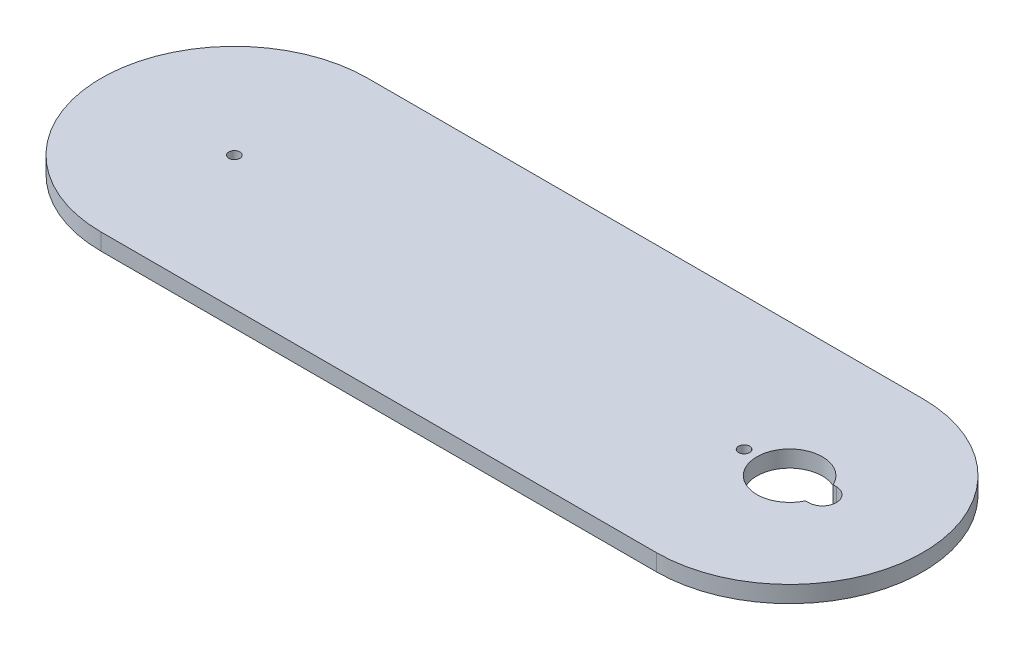
ISO-10303-21;
HEADER;
FILE_DESCRIPTION(('STEP AP214'),'2;1');
FILE_NAME('part.step','',(''),(''),'','','');
FILE_SCHEMA(('AUTOMOTIVE_DESIGN { 1 0 10303 214 1 1 1 1 }'));
ENDSEC;
DATA;
#1=APPLICATION_CONTEXT('core data for automotive mechanical design processes');
#2=APPLICATION_PROTOCOL_DEFINITION('international standard','automotive_design',2000,#1);
#3=PRODUCT_CONTEXT('',#1,'mechanical');
#4=PRODUCT('Part','Part','',(#3));
#5=PRODUCT_RELATED_PRODUCT_CATEGORY('part','',(#4));
#6=PRODUCT_DEFINITION_FORMATION('','',#4);
#7=PRODUCT_DEFINITION_CONTEXT('part definition',#1,'design');
#8=PRODUCT_DEFINITION('design','',#6,#7);
#9=PRODUCT_DEFINITION_SHAPE('','',#8);
#10=(LENGTH_UNIT() NAMED_UNIT(*) SI_UNIT(.MILLI.,.METRE.));
#11=(NAMED_UNIT(*) PLANE_ANGLE_UNIT() SI_UNIT($,.RADIAN.));
#12=(NAMED_UNIT(*) SI_UNIT($,.STERADIAN.) SOLID_ANGLE_UNIT());
#13=UNCERTAINTY_MEASURE_WITH_UNIT(LENGTH_MEASURE(1.E-05),#10,'distance_accuracy_value','');
#14=(GEOMETRIC_REPRESENTATION_CONTEXT(3) GLOBAL_UNCERTAINTY_ASSIGNED_CONTEXT((#13)) GLOBAL_UNIT_ASSIGNED_CONTEXT((#10,
#11,#12)) REPRESENTATION_CONTEXT('',''));
#15=CARTESIAN_POINT('',(0.,0.,0.));
#16=DIRECTION('',(0.,0.,1.));
#17=DIRECTION('',(1.,0.,0.));
#18=AXIS2_PLACEMENT_3D('',#15,#16,#17);
#19=CARTESIAN_POINT('',(0.,3.,0.));
#20=DIRECTION('',(0.,-1.,0.));
#21=DIRECTION('',(0.,0.,-1.));
#22=AXIS2_PLACEMENT_3D('',#19,#20,#21);
#23=CYLINDRICAL_SURFACE('',#22,24.);
#24=CARTESIAN_POINT('',(0.,0.,0.));
#25=DIRECTION('',(0.,1.,0.));
#26=DIRECTION('',(0.,0.,1.));
#27=AXIS2_PLACEMENT_3D('',#24,#25,#26);
#28=CIRCLE('',#27,24.);
#29=CARTESIAN_POINT('',(0.,0.,-24.));
#30=VERTEX_POINT('',#29);
#31=CARTESIAN_POINT('',(0.,0.,24.));
#32=VERTEX_POINT('',#31);
#33=EDGE_CURVE('E141',#30,#32,#28,.T.);
#34=ORIENTED_EDGE('',*,*,#33,.T.);
#35=DIRECTION('',(0.,-1.,0.));
#36=VECTOR('',#35,1.);
#37=CARTESIAN_POINT('',(0.,3.,24.));
#38=LINE('',#37,#36);
#39=CARTESIAN_POINT('',(0.,3.,24.));
#40=VERTEX_POINT('',#39);
#41=EDGE_CURVE('E11',#40,#32,#38,.T.);
#42=ORIENTED_EDGE('',*,*,#41,.F.);
#43=CARTESIAN_POINT('',(0.,3.,0.));
#44=DIRECTION('',(0.,1.,0.));
#45=DIRECTION('',(0.,0.,1.));
#46=AXIS2_PLACEMENT_3D('',#43,#44,#45);
#47=CIRCLE('',#46,24.);
#48=CARTESIAN_POINT('',(0.,3.,-24.));
#49=VERTEX_POINT('',#48);
#50=EDGE_CURVE('E144',#49,#40,#47,.T.);
#51=ORIENTED_EDGE('',*,*,#50,.F.);
#52=DIRECTION('',(0.,-1.,0.));
#53=VECTOR('',#52,1.);
#54=CARTESIAN_POINT('',(0.,3.,-24.));
#55=LINE('',#54,#53);
#56=EDGE_CURVE('E154',#49,#30,#55,.T.);
#57=ORIENTED_EDGE('',*,*,#56,.T.);
#58=EDGE_LOOP('',(#34,#42,#51,#57));
#59=FACE_BOUND('',#58,.T.);
#60=ADVANCED_FACE('F33',(#59),#23,.T.);
#61=CARTESIAN_POINT('',(100.,3.,24.));
#62=DIRECTION('',(0.,0.,-1.));
#63=DIRECTION('',(-1.,0.,0.));
#64=AXIS2_PLACEMENT_3D('',#61,#62,#63);
#65=PLANE('',#64);
#66=DIRECTION('',(1.,0.,0.));
#67=VECTOR('',#66,1.);
#68=CARTESIAN_POINT('',(100.,0.,24.));
#69=LINE('',#68,#67);
#70=CARTESIAN_POINT('',(100.,0.,24.));
#71=VERTEX_POINT('',#70);
#72=EDGE_CURVE('E157',#32,#71,#69,.T.);
#73=ORIENTED_EDGE('',*,*,#72,.T.);
#74=DIRECTION('',(0.,-1.,0.));
#75=VECTOR('',#74,1.);
#76=CARTESIAN_POINT('',(100.,3.,24.));
#77=LINE('',#76,#75);
#78=CARTESIAN_POINT('',(100.,3.,24.));
#79=VERTEX_POINT('',#78);
#80=EDGE_CURVE('E40',#79,#71,#77,.T.);
#81=ORIENTED_EDGE('',*,*,#80,.F.);
#82=DIRECTION('',(1.,0.,0.));
#83=VECTOR('',#82,1.);
#84=CARTESIAN_POINT('',(100.,3.,24.));
#85=LINE('',#84,#83);
#86=EDGE_CURVE('E147',#40,#79,#85,.T.);
#87=ORIENTED_EDGE('',*,*,#86,.F.);
#88=ORIENTED_EDGE('',*,*,#41,.T.);
#89=EDGE_LOOP('',(#73,#81,#87,#88));
#90=FACE_BOUND('',#89,.T.);
#91=ADVANCED_FACE('F186',(#90),#65,.F.);
#92=CARTESIAN_POINT('',(100.,3.,0.));
#93=DIRECTION('',(0.,-1.,0.));
#94=DIRECTION('',(0.,0.,-1.));
#95=AXIS2_PLACEMENT_3D('',#92,#93,#94);
#96=CYLINDRICAL_SURFACE('',#95,24.);
#97=CARTESIAN_POINT('',(100.,0.,0.));
#98=DIRECTION('',(0.,1.,0.));
#99=DIRECTION('',(0.,0.,-1.));
#100=AXIS2_PLACEMENT_3D('',#97,#98,#99);
#101=CIRCLE('',#100,24.);
#102=CARTESIAN_POINT('',(100.,0.,-24.));
#103=VERTEX_POINT('',#102);
#104=EDGE_CURVE('E159',#71,#103,#101,.T.);
#105=ORIENTED_EDGE('',*,*,#104,.T.);
#106=DIRECTION('',(0.,-1.,0.));
#107=VECTOR('',#106,1.);
#108=CARTESIAN_POINT('',(100.,3.,-24.));
#109=LINE('',#108,#107);
#110=CARTESIAN_POINT('',(100.,3.,-24.));
#111=VERTEX_POINT('',#110);
#112=EDGE_CURVE('E164',#111,#103,#109,.T.);
#113=ORIENTED_EDGE('',*,*,#112,.F.);
#114=CARTESIAN_POINT('',(100.,3.,0.));
#115=DIRECTION('',(0.,1.,0.));
#116=DIRECTION('',(0.,0.,-1.));
#117=AXIS2_PLACEMENT_3D('',#114,#115,#116);
#118=CIRCLE('',#117,24.);
#119=EDGE_CURVE('E150',#79,#111,#118,.T.);
#120=ORIENTED_EDGE('',*,*,#119,.F.);
#121=ORIENTED_EDGE('',*,*,#80,.T.);
#122=EDGE_LOOP('',(#105,#113,#120,#121));
#123=FACE_BOUND('',#122,.T.);
#124=ADVANCED_FACE('F171',(#123),#96,.T.);
#125=CARTESIAN_POINT('',(0.,3.,-24.));
#126=DIRECTION('',(0.,0.,1.));
#127=DIRECTION('',(1.,0.,0.));
#128=AXIS2_PLACEMENT_3D('',#125,#126,#127);
#129=PLANE('',#128);
#130=DIRECTION('',(-1.,0.,0.));
#131=VECTOR('',#130,1.);
#132=CARTESIAN_POINT('',(0.,0.,-24.));
#133=LINE('',#132,#131);
#134=EDGE_CURVE('E148',#103,#30,#133,.T.);
#135=ORIENTED_EDGE('',*,*,#134,.T.);
#136=ORIENTED_EDGE('',*,*,#56,.F.);
#137=DIRECTION('',(-1.,0.,0.));
#138=VECTOR('',#137,1.);
#139=CARTESIAN_POINT('',(0.,3.,-24.));
#140=LINE('',#139,#138);
#141=EDGE_CURVE('E152',#111,#49,#140,.T.);
#142=ORIENTED_EDGE('',*,*,#141,.F.);
#143=ORIENTED_EDGE('',*,*,#112,.T.);
#144=EDGE_LOOP('',(#135,#136,#142,#143));
#145=FACE_BOUND('',#144,.T.);
#146=ADVANCED_FACE('F179',(#145),#129,.F.);
#147=CARTESIAN_POINT('',(0.,3.,0.));
#148=DIRECTION('',(0.,1.,0.));
#149=DIRECTION('',(0.,0.,1.));
#150=AXIS2_PLACEMENT_3D('',#147,#148,#149);
#151=PLANE('',#150);
#152=CARTESIAN_POINT('',(91.8,3.,0.));
#153=DIRECTION('',(0.,1.,0.));
#154=DIRECTION('',(0.,0.,1.));
#155=AXIS2_PLACEMENT_3D('',#152,#153,#154);
#156=CIRCLE('',#155,0.999999999999998);
#157=CARTESIAN_POINT('',(91.8,3.,0.999999999999998));
#158=VERTEX_POINT('',#157);
#159=EDGE_CURVE('E121',#158,#158,#156,.T.);
#160=ORIENTED_EDGE('',*,*,#159,.F.);
#161=EDGE_LOOP('',(#160));
#162=FACE_BOUND('',#161,.T.);
#163=CARTESIAN_POINT('',(100.,3.,0.));
#164=DIRECTION('',(0.,1.,0.));
#165=DIRECTION('',(0.,0.,1.));
#166=AXIS2_PLACEMENT_3D('',#163,#164,#165);
#167=CIRCLE('',#166,5.90000000000001);
#168=CARTESIAN_POINT('',(105.344155686355,3.,-2.5));
#169=VERTEX_POINT('',#168);
#170=CARTESIAN_POINT('',(105.344155686355,3.,2.5));
#171=VERTEX_POINT('',#170);
#172=EDGE_CURVE('E47',#169,#171,#167,.T.);
#173=ORIENTED_EDGE('',*,*,#172,.F.);
#174=DIRECTION('',(-1.,0.,0.));
#175=VECTOR('',#174,1.);
#176=CARTESIAN_POINT('',(105.344155686355,3.,-2.5));
#177=LINE('',#176,#175);
#178=CARTESIAN_POINT('',(105.904155686355,3.,-2.5));
#179=VERTEX_POINT('',#178);
#180=EDGE_CURVE('E115',#179,#169,#177,.T.);
#181=ORIENTED_EDGE('',*,*,#180,.F.);
#182=CARTESIAN_POINT('',(105.904155686355,3.,0.));
#183=DIRECTION('',(0.,1.,0.));
#184=DIRECTION('',(0.,0.,-1.));
#185=AXIS2_PLACEMENT_3D('',#182,#183,#184);
#186=CIRCLE('',#185,2.5);
#187=CARTESIAN_POINT('',(105.904155686355,3.,2.5));
#188=VERTEX_POINT('',#187);
#189=EDGE_CURVE('E118',#188,#179,#186,.T.);
#190=ORIENTED_EDGE('',*,*,#189,.F.);
#191=DIRECTION('',(1.,0.,0.));
#192=VECTOR('',#191,1.);
#193=CARTESIAN_POINT('',(105.904155686355,3.,2.5));
#194=LINE('',#193,#192);
#195=EDGE_CURVE('E127',#171,#188,#194,.T.);
#196=ORIENTED_EDGE('',*,*,#195,.F.);
#197=EDGE_LOOP('',(#173,#181,#190,#196));
#198=FACE_BOUND('',#197,.T.);
#199=CARTESIAN_POINT('',(0.,3.,0.));
#200=DIRECTION('',(0.,1.,0.));
#201=DIRECTION('',(0.,0.,1.));
#202=AXIS2_PLACEMENT_3D('',#199,#200,#201);
#203=CIRCLE('',#202,1.);
#204=CARTESIAN_POINT('',(0.,3.,1.));
#205=VERTEX_POINT('',#204);
#206=EDGE_CURVE('E134',#205,#205,#203,.T.);
#207=ORIENTED_EDGE('',*,*,#206,.F.);
#208=EDGE_LOOP('',(#207));
#209=FACE_BOUND('',#208,.T.);
#210=ORIENTED_EDGE('',*,*,#50,.T.);
#211=ORIENTED_EDGE('',*,*,#86,.T.);
#212=ORIENTED_EDGE('',*,*,#119,.T.);
#213=ORIENTED_EDGE('',*,*,#141,.T.);
#214=EDGE_LOOP('',(#210,#211,#212,#213));
#215=FACE_BOUND('',#214,.T.);
#216=ADVANCED_FACE('F185',(#162,#198,#209,#215),#151,.T.);
#217=CARTESIAN_POINT('',(0.,0.,0.));
#218=DIRECTION('',(0.,1.,0.));
#219=DIRECTION('',(0.,0.,1.));
#220=AXIS2_PLACEMENT_3D('',#217,#218,#219);
#221=PLANE('',#220);
#222=CARTESIAN_POINT('',(91.8,0.,0.));
#223=DIRECTION('',(0.,1.,0.));
#224=DIRECTION('',(0.,0.,1.));
#225=AXIS2_PLACEMENT_3D('',#222,#223,#224);
#226=CIRCLE('',#225,0.999999999999998);
#227=CARTESIAN_POINT('',(91.8,0.,0.999999999999998));
#228=VERTEX_POINT('',#227);
#229=EDGE_CURVE('E128',#228,#228,#226,.T.);
#230=ORIENTED_EDGE('',*,*,#229,.T.);
#231=EDGE_LOOP('',(#230));
#232=FACE_BOUND('',#231,.T.);
#233=DIRECTION('',(-1.,0.,0.));
#234=VECTOR('',#233,1.);
#235=CARTESIAN_POINT('',(105.344155686355,0.,-2.5));
#236=LINE('',#235,#234);
#237=CARTESIAN_POINT('',(105.904155686355,0.,-2.5));
#238=VERTEX_POINT('',#237);
#239=CARTESIAN_POINT('',(105.344155686355,0.,-2.5));
#240=VERTEX_POINT('',#239);
#241=EDGE_CURVE('E105',#238,#240,#236,.T.);
#242=ORIENTED_EDGE('',*,*,#241,.T.);
#243=CARTESIAN_POINT('',(100.,0.,0.));
#244=DIRECTION('',(0.,1.,0.));
#245=DIRECTION('',(0.,0.,1.));
#246=AXIS2_PLACEMENT_3D('',#243,#244,#245);
#247=CIRCLE('',#246,5.90000000000001);
#248=CARTESIAN_POINT('',(105.344155686355,0.,2.5));
#249=VERTEX_POINT('',#248);
#250=EDGE_CURVE('E99',#240,#249,#247,.T.);
#251=ORIENTED_EDGE('',*,*,#250,.T.);
#252=DIRECTION('',(1.,0.,0.));
#253=VECTOR('',#252,1.);
#254=CARTESIAN_POINT('',(105.904155686355,0.,2.5));
#255=LINE('',#254,#253);
#256=CARTESIAN_POINT('',(105.904155686355,0.,2.5));
#257=VERTEX_POINT('',#256);
#258=EDGE_CURVE('E108',#249,#257,#255,.T.);
#259=ORIENTED_EDGE('',*,*,#258,.T.);
#260=CARTESIAN_POINT('',(105.904155686355,0.,0.));
#261=DIRECTION('',(0.,1.,0.));
#262=DIRECTION('',(0.,0.,-1.));
#263=AXIS2_PLACEMENT_3D('',#260,#261,#262);
#264=CIRCLE('',#263,2.5);
#265=EDGE_CURVE('E55',#257,#238,#264,.T.);
#266=ORIENTED_EDGE('',*,*,#265,.T.);
#267=EDGE_LOOP('',(#242,#251,#259,#266));
#268=FACE_BOUND('',#267,.T.);
#269=CARTESIAN_POINT('',(0.,0.,0.));
#270=DIRECTION('',(0.,1.,0.));
#271=DIRECTION('',(0.,0.,1.));
#272=AXIS2_PLACEMENT_3D('',#269,#270,#271);
#273=CIRCLE('',#272,1.);
#274=CARTESIAN_POINT('',(0.,0.,1.));
#275=VERTEX_POINT('',#274);
#276=EDGE_CURVE('E138',#275,#275,#273,.T.);
#277=ORIENTED_EDGE('',*,*,#276,.T.);
#278=EDGE_LOOP('',(#277));
#279=FACE_BOUND('',#278,.T.);
#280=ORIENTED_EDGE('',*,*,#33,.F.);
#281=ORIENTED_EDGE('',*,*,#134,.F.);
#282=ORIENTED_EDGE('',*,*,#104,.F.);
#283=ORIENTED_EDGE('',*,*,#72,.F.);
#284=EDGE_LOOP('',(#280,#281,#282,#283));
#285=FACE_BOUND('',#284,.T.);
#286=ADVANCED_FACE('F112',(#232,#268,#279,#285),#221,.F.);
#287=CARTESIAN_POINT('',(0.,0.,0.));
#288=DIRECTION('',(0.,1.,0.));
#289=DIRECTION('',(0.,0.,1.));
#290=AXIS2_PLACEMENT_3D('',#287,#288,#289);
#291=CYLINDRICAL_SURFACE('',#290,1.);
#292=ORIENTED_EDGE('',*,*,#276,.F.);
#293=EDGE_LOOP('',(#292));
#294=FACE_BOUND('',#293,.T.);
#295=ORIENTED_EDGE('',*,*,#206,.T.);
#296=EDGE_LOOP('',(#295));
#297=FACE_BOUND('',#296,.T.);
#298=ADVANCED_FACE('F198',(#294,#297),#291,.F.);
#299=CARTESIAN_POINT('',(100.,0.,0.));
#300=DIRECTION('',(0.,1.,0.));
#301=DIRECTION('',(0.,0.,1.));
#302=AXIS2_PLACEMENT_3D('',#299,#300,#301);
#303=CYLINDRICAL_SURFACE('',#302,5.90000000000001);
#304=ORIENTED_EDGE('',*,*,#172,.T.);
#305=DIRECTION('',(0.,1.,0.));
#306=VECTOR('',#305,1.);
#307=CARTESIAN_POINT('',(105.344155686355,0.,2.5));
#308=LINE('',#307,#306);
#309=EDGE_CURVE('E95',#249,#171,#308,.T.);
#310=ORIENTED_EDGE('',*,*,#309,.F.);
#311=ORIENTED_EDGE('',*,*,#250,.F.);
#312=DIRECTION('',(0.,1.,0.));
#313=VECTOR('',#312,1.);
#314=CARTESIAN_POINT('',(105.344155686355,0.,-2.5));
#315=LINE('',#314,#313);
#316=EDGE_CURVE('E132',#240,#169,#315,.T.);
#317=ORIENTED_EDGE('',*,*,#316,.T.);
#318=EDGE_LOOP('',(#304,#310,#311,#317));
#319=FACE_BOUND('',#318,.T.);
#320=ADVANCED_FACE('F97',(#319),#303,.F.);
#321=CARTESIAN_POINT('',(105.344155686355,0.,-2.5));
#322=DIRECTION('',(0.,0.,-1.));
#323=DIRECTION('',(-1.,0.,0.));
#324=AXIS2_PLACEMENT_3D('',#321,#322,#323);
#325=PLANE('',#324);
#326=ORIENTED_EDGE('',*,*,#180,.T.);
#327=ORIENTED_EDGE('',*,*,#316,.F.);
#328=ORIENTED_EDGE('',*,*,#241,.F.);
#329=DIRECTION('',(0.,1.,0.));
#330=VECTOR('',#329,1.);
#331=CARTESIAN_POINT('',(105.904155686355,0.,-2.5));
#332=LINE('',#331,#330);
#333=EDGE_CURVE('E135',#238,#179,#332,.T.);
#334=ORIENTED_EDGE('',*,*,#333,.T.);
#335=EDGE_LOOP('',(#326,#327,#328,#334));
#336=FACE_BOUND('',#335,.T.);
#337=ADVANCED_FACE('F208',(#336),#325,.F.);
#338=CARTESIAN_POINT('',(105.904155686355,0.,0.));
#339=DIRECTION('',(0.,1.,0.));
#340=DIRECTION('',(0.,0.,1.));
#341=AXIS2_PLACEMENT_3D('',#338,#339,#340);
#342=CYLINDRICAL_SURFACE('',#341,2.5);
#343=ORIENTED_EDGE('',*,*,#189,.T.);
#344=ORIENTED_EDGE('',*,*,#333,.F.);
#345=ORIENTED_EDGE('',*,*,#265,.F.);
#346=DIRECTION('',(0.,1.,0.));
#347=VECTOR('',#346,1.);
#348=CARTESIAN_POINT('',(105.904155686355,0.,2.5));
#349=LINE('',#348,#347);
#350=EDGE_CURVE('E104',#257,#188,#349,.T.);
#351=ORIENTED_EDGE('',*,*,#350,.T.);
#352=EDGE_LOOP('',(#343,#344,#345,#351));
#353=FACE_BOUND('',#352,.T.);
#354=ADVANCED_FACE('F212',(#353),#342,.F.);
#355=CARTESIAN_POINT('',(105.904155686355,0.,2.5));
#356=DIRECTION('',(0.,0.,1.));
#357=DIRECTION('',(1.,0.,0.));
#358=AXIS2_PLACEMENT_3D('',#355,#356,#357);
#359=PLANE('',#358);
#360=ORIENTED_EDGE('',*,*,#195,.T.);
#361=ORIENTED_EDGE('',*,*,#350,.F.);
#362=ORIENTED_EDGE('',*,*,#258,.F.);
#363=ORIENTED_EDGE('',*,*,#309,.T.);
#364=EDGE_LOOP('',(#360,#361,#362,#363));
#365=FACE_BOUND('',#364,.T.);
#366=ADVANCED_FACE('F109',(#365),#359,.F.);
#367=CARTESIAN_POINT('',(91.8,0.,0.));
#368=DIRECTION('',(0.,1.,0.));
#369=DIRECTION('',(0.,0.,1.));
#370=AXIS2_PLACEMENT_3D('',#367,#368,#369);
#371=CYLINDRICAL_SURFACE('',#370,0.999999999999998);
#372=ORIENTED_EDGE('',*,*,#229,.F.);
#373=EDGE_LOOP('',(#372));
#374=FACE_BOUND('',#373,.T.);
#375=ORIENTED_EDGE('',*,*,#159,.T.);
#376=EDGE_LOOP('',(#375));
#377=FACE_BOUND('',#376,.T.);
#378=ADVANCED_FACE('F211',(#374,#377),#371,.F.);
#379=CLOSED_SHELL('',(#60,#91,#124,#146,#216,#286,#298,#320,#337,#354,#366,#378));
#380=MANIFOLD_SOLID_BREP('B2',#379);
#381=ADVANCED_BREP_SHAPE_REPRESENTATION('',(#18,#380),#14);
#382=SHAPE_DEFINITION_REPRESENTATION(#9,#381);
ENDSEC;
END-ISO-10303-21;
